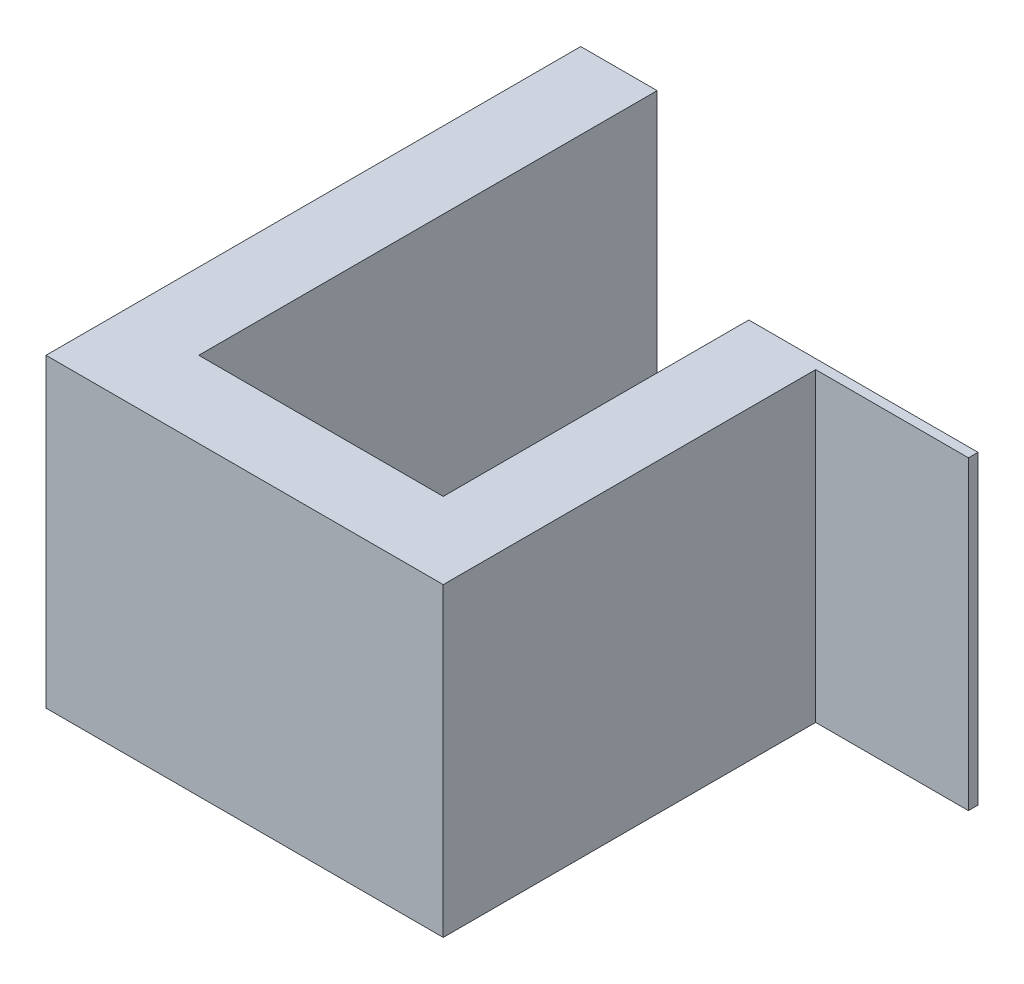
ISO-10303-21;
HEADER;
FILE_DESCRIPTION(('STEP AP214'),'2;1');
FILE_NAME('part.step','',(''),(''),'','','');
FILE_SCHEMA(('AUTOMOTIVE_DESIGN { 1 0 10303 214 1 1 1 1 }'));
ENDSEC;
DATA;
#1=APPLICATION_CONTEXT('core data for automotive mechanical design processes');
#2=APPLICATION_PROTOCOL_DEFINITION('international standard','automotive_design',2000,#1);
#3=PRODUCT_CONTEXT('',#1,'mechanical');
#4=PRODUCT('Part','Part','',(#3));
#5=PRODUCT_RELATED_PRODUCT_CATEGORY('part','',(#4));
#6=PRODUCT_DEFINITION_FORMATION('','',#4);
#7=PRODUCT_DEFINITION_CONTEXT('part definition',#1,'design');
#8=PRODUCT_DEFINITION('design','',#6,#7);
#9=PRODUCT_DEFINITION_SHAPE('','',#8);
#10=(LENGTH_UNIT() NAMED_UNIT(*) SI_UNIT(.MILLI.,.METRE.));
#11=(NAMED_UNIT(*) PLANE_ANGLE_UNIT() SI_UNIT($,.RADIAN.));
#12=(NAMED_UNIT(*) SI_UNIT($,.STERADIAN.) SOLID_ANGLE_UNIT());
#13=UNCERTAINTY_MEASURE_WITH_UNIT(LENGTH_MEASURE(1.E-05),#10,'distance_accuracy_value','');
#14=(GEOMETRIC_REPRESENTATION_CONTEXT(3) GLOBAL_UNCERTAINTY_ASSIGNED_CONTEXT((#13)) GLOBAL_UNIT_ASSIGNED_CONTEXT((#10,
#11,#12)) REPRESENTATION_CONTEXT('',''));
#15=CARTESIAN_POINT('',(0.,0.,0.));
#16=DIRECTION('',(0.,0.,1.));
#17=DIRECTION('',(1.,0.,0.));
#18=AXIS2_PLACEMENT_3D('',#15,#16,#17);
#19=CARTESIAN_POINT('',(0.,12.7,15.875));
#20=DIRECTION('',(0.,0.,-1.));
#21=DIRECTION('',(-1.,0.,0.));
#22=AXIS2_PLACEMENT_3D('',#19,#20,#21);
#23=PLANE('',#22);
#24=DIRECTION('',(1.,0.,0.));
#25=VECTOR('',#24,1.);
#26=CARTESIAN_POINT('',(0.,0.,15.875));
#27=LINE('',#26,#25);
#28=CARTESIAN_POINT('',(-13.335,0.,15.875));
#29=VERTEX_POINT('',#28);
#30=CARTESIAN_POINT('',(3.175,0.,15.875));
#31=VERTEX_POINT('',#30);
#32=EDGE_CURVE('E153',#29,#31,#27,.T.);
#33=ORIENTED_EDGE('',*,*,#32,.T.);
#34=DIRECTION('',(0.,-1.,0.));
#35=VECTOR('',#34,1.);
#36=CARTESIAN_POINT('',(3.175,12.7,15.875));
#37=LINE('',#36,#35);
#38=CARTESIAN_POINT('',(3.175,12.7,15.875));
#39=VERTEX_POINT('',#38);
#40=EDGE_CURVE('E87',#39,#31,#37,.T.);
#41=ORIENTED_EDGE('',*,*,#40,.F.);
#42=DIRECTION('',(1.,0.,0.));
#43=VECTOR('',#42,1.);
#44=CARTESIAN_POINT('',(0.,12.7,15.875));
#45=LINE('',#44,#43);
#46=CARTESIAN_POINT('',(-13.335,12.7,15.875));
#47=VERTEX_POINT('',#46);
#48=EDGE_CURVE('E185',#47,#39,#45,.T.);
#49=ORIENTED_EDGE('',*,*,#48,.F.);
#50=DIRECTION('',(0.,-1.,0.));
#51=VECTOR('',#50,1.);
#52=CARTESIAN_POINT('',(-13.335,12.7,15.875));
#53=LINE('',#52,#51);
#54=EDGE_CURVE('E186',#47,#29,#53,.T.);
#55=ORIENTED_EDGE('',*,*,#54,.T.);
#56=EDGE_LOOP('',(#33,#41,#49,#55));
#57=FACE_BOUND('',#56,.T.);
#58=ADVANCED_FACE('F77',(#57),#23,.F.);
#59=CARTESIAN_POINT('',(3.175,12.7,0.));
#60=DIRECTION('',(1.,0.,0.));
#61=DIRECTION('',(0.,0.,-1.));
#62=AXIS2_PLACEMENT_3D('',#59,#60,#61);
#63=PLANE('',#62);
#64=DIRECTION('',(0.,-1.,0.));
#65=VECTOR('',#64,1.);
#66=CARTESIAN_POINT('',(3.175,12.7,0.396875));
#67=LINE('',#66,#65);
#68=CARTESIAN_POINT('',(3.175,12.7,0.396875));
#69=VERTEX_POINT('',#68);
#70=CARTESIAN_POINT('',(3.175,0.,0.396875));
#71=VERTEX_POINT('',#70);
#72=EDGE_CURVE('E12',#69,#71,#67,.T.);
#73=ORIENTED_EDGE('',*,*,#72,.F.);
#74=DIRECTION('',(0.,0.,1.));
#75=VECTOR('',#74,1.);
#76=CARTESIAN_POINT('',(3.175,12.7,0.));
#77=LINE('',#76,#75);
#78=EDGE_CURVE('E218',#69,#39,#77,.T.);
#79=ORIENTED_EDGE('',*,*,#78,.T.);
#80=ORIENTED_EDGE('',*,*,#40,.T.);
#81=DIRECTION('',(0.,0.,1.));
#82=VECTOR('',#81,1.);
#83=CARTESIAN_POINT('',(3.175,0.,0.));
#84=LINE('',#83,#82);
#85=EDGE_CURVE('E131',#71,#31,#84,.T.);
#86=ORIENTED_EDGE('',*,*,#85,.F.);
#87=EDGE_LOOP('',(#73,#79,#80,#86));
#88=FACE_BOUND('',#87,.T.);
#89=ADVANCED_FACE('F220',(#88),#63,.T.);
#90=CARTESIAN_POINT('',(0.,12.7,0.));
#91=DIRECTION('',(0.,0.,-1.));
#92=DIRECTION('',(-1.,0.,0.));
#93=AXIS2_PLACEMENT_3D('',#90,#91,#92);
#94=PLANE('',#93);
#95=DIRECTION('',(1.,0.,0.));
#96=VECTOR('',#95,1.);
#97=CARTESIAN_POINT('',(0.,0.,0.));
#98=LINE('',#97,#96);
#99=CARTESIAN_POINT('',(0.,0.,0.));
#100=VERTEX_POINT('',#99);
#101=CARTESIAN_POINT('',(9.525,0.,0.));
#102=VERTEX_POINT('',#101);
#103=EDGE_CURVE('E118',#100,#102,#98,.T.);
#104=ORIENTED_EDGE('',*,*,#103,.F.);
#105=DIRECTION('',(0.,-1.,0.));
#106=VECTOR('',#105,1.);
#107=CARTESIAN_POINT('',(0.,12.7,0.));
#108=LINE('',#107,#106);
#109=CARTESIAN_POINT('',(0.,12.7,0.));
#110=VERTEX_POINT('',#109);
#111=EDGE_CURVE('E205',#110,#100,#108,.T.);
#112=ORIENTED_EDGE('',*,*,#111,.F.);
#113=DIRECTION('',(1.,0.,0.));
#114=VECTOR('',#113,1.);
#115=CARTESIAN_POINT('',(0.,12.7,0.));
#116=LINE('',#115,#114);
#117=CARTESIAN_POINT('',(9.525,12.7,0.));
#118=VERTEX_POINT('',#117);
#119=EDGE_CURVE('E137',#110,#118,#116,.T.);
#120=ORIENTED_EDGE('',*,*,#119,.T.);
#121=DIRECTION('',(0.,-1.,0.));
#122=VECTOR('',#121,1.);
#123=CARTESIAN_POINT('',(9.525,12.7,0.));
#124=LINE('',#123,#122);
#125=EDGE_CURVE('E134',#118,#102,#124,.T.);
#126=ORIENTED_EDGE('',*,*,#125,.T.);
#127=EDGE_LOOP('',(#104,#112,#120,#126));
#128=FACE_BOUND('',#127,.T.);
#129=ADVANCED_FACE('F135',(#128),#94,.T.);
#130=CARTESIAN_POINT('',(0.,12.7,0.));
#131=DIRECTION('',(1.,0.,0.));
#132=DIRECTION('',(0.,0.,-1.));
#133=AXIS2_PLACEMENT_3D('',#130,#131,#132);
#134=PLANE('',#133);
#135=DIRECTION('',(0.,0.,1.));
#136=VECTOR('',#135,1.);
#137=CARTESIAN_POINT('',(0.,0.,0.));
#138=LINE('',#137,#136);
#139=CARTESIAN_POINT('',(0.,0.,12.7));
#140=VERTEX_POINT('',#139);
#141=EDGE_CURVE('E127',#100,#140,#138,.T.);
#142=ORIENTED_EDGE('',*,*,#141,.T.);
#143=DIRECTION('',(0.,-1.,0.));
#144=VECTOR('',#143,1.);
#145=CARTESIAN_POINT('',(0.,12.7,12.7));
#146=LINE('',#145,#144);
#147=CARTESIAN_POINT('',(0.,12.7,12.7));
#148=VERTEX_POINT('',#147);
#149=EDGE_CURVE('E201',#148,#140,#146,.T.);
#150=ORIENTED_EDGE('',*,*,#149,.F.);
#151=DIRECTION('',(0.,0.,1.));
#152=VECTOR('',#151,1.);
#153=CARTESIAN_POINT('',(0.,12.7,0.));
#154=LINE('',#153,#152);
#155=EDGE_CURVE('E274',#110,#148,#154,.T.);
#156=ORIENTED_EDGE('',*,*,#155,.F.);
#157=ORIENTED_EDGE('',*,*,#111,.T.);
#158=EDGE_LOOP('',(#142,#150,#156,#157));
#159=FACE_BOUND('',#158,.T.);
#160=ADVANCED_FACE('F273',(#159),#134,.F.);
#161=CARTESIAN_POINT('',(0.,12.7,12.7));
#162=DIRECTION('',(0.,0.,1.));
#163=DIRECTION('',(1.,0.,0.));
#164=AXIS2_PLACEMENT_3D('',#161,#162,#163);
#165=PLANE('',#164);
#166=DIRECTION('',(-1.,0.,0.));
#167=VECTOR('',#166,1.);
#168=CARTESIAN_POINT('',(0.,0.,12.7));
#169=LINE('',#168,#167);
#170=CARTESIAN_POINT('',(-10.16,0.,12.7));
#171=VERTEX_POINT('',#170);
#172=EDGE_CURVE('E169',#140,#171,#169,.T.);
#173=ORIENTED_EDGE('',*,*,#172,.T.);
#174=DIRECTION('',(0.,-1.,0.));
#175=VECTOR('',#174,1.);
#176=CARTESIAN_POINT('',(-10.16,12.7,12.7));
#177=LINE('',#176,#175);
#178=CARTESIAN_POINT('',(-10.16,12.7,12.7));
#179=VERTEX_POINT('',#178);
#180=EDGE_CURVE('E197',#179,#171,#177,.T.);
#181=ORIENTED_EDGE('',*,*,#180,.F.);
#182=DIRECTION('',(-1.,0.,0.));
#183=VECTOR('',#182,1.);
#184=CARTESIAN_POINT('',(0.,12.7,12.7));
#185=LINE('',#184,#183);
#186=EDGE_CURVE('E269',#148,#179,#185,.T.);
#187=ORIENTED_EDGE('',*,*,#186,.F.);
#188=ORIENTED_EDGE('',*,*,#149,.T.);
#189=EDGE_LOOP('',(#173,#181,#187,#188));
#190=FACE_BOUND('',#189,.T.);
#191=ADVANCED_FACE('F268',(#190),#165,.F.);
#192=CARTESIAN_POINT('',(-10.16,12.7,0.));
#193=DIRECTION('',(-1.,0.,0.));
#194=DIRECTION('',(0.,0.,1.));
#195=AXIS2_PLACEMENT_3D('',#192,#193,#194);
#196=PLANE('',#195);
#197=DIRECTION('',(0.,0.,-1.));
#198=VECTOR('',#197,1.);
#199=CARTESIAN_POINT('',(-10.16,0.,0.));
#200=LINE('',#199,#198);
#201=CARTESIAN_POINT('',(-10.16,0.,-6.35));
#202=VERTEX_POINT('',#201);
#203=EDGE_CURVE('E173',#171,#202,#200,.T.);
#204=ORIENTED_EDGE('',*,*,#203,.T.);
#205=DIRECTION('',(0.,-1.,0.));
#206=VECTOR('',#205,1.);
#207=CARTESIAN_POINT('',(-10.16,12.7,-6.35));
#208=LINE('',#207,#206);
#209=CARTESIAN_POINT('',(-10.16,12.7,-6.35));
#210=VERTEX_POINT('',#209);
#211=EDGE_CURVE('E193',#210,#202,#208,.T.);
#212=ORIENTED_EDGE('',*,*,#211,.F.);
#213=DIRECTION('',(0.,0.,-1.));
#214=VECTOR('',#213,1.);
#215=CARTESIAN_POINT('',(-10.16,12.7,0.));
#216=LINE('',#215,#214);
#217=EDGE_CURVE('E265',#179,#210,#216,.T.);
#218=ORIENTED_EDGE('',*,*,#217,.F.);
#219=ORIENTED_EDGE('',*,*,#180,.T.);
#220=EDGE_LOOP('',(#204,#212,#218,#219));
#221=FACE_BOUND('',#220,.T.);
#222=ADVANCED_FACE('F262',(#221),#196,.F.);
#223=CARTESIAN_POINT('',(0.,12.7,-6.34999999999999));
#224=DIRECTION('',(0.,0.,1.));
#225=DIRECTION('',(1.,0.,0.));
#226=AXIS2_PLACEMENT_3D('',#223,#224,#225);
#227=PLANE('',#226);
#228=DIRECTION('',(-1.,0.,0.));
#229=VECTOR('',#228,1.);
#230=CARTESIAN_POINT('',(0.,0.,-6.34999999999999));
#231=LINE('',#230,#229);
#232=CARTESIAN_POINT('',(-13.335,0.,-6.35));
#233=VERTEX_POINT('',#232);
#234=EDGE_CURVE('E177',#202,#233,#231,.T.);
#235=ORIENTED_EDGE('',*,*,#234,.T.);
#236=DIRECTION('',(0.,-1.,0.));
#237=VECTOR('',#236,1.);
#238=CARTESIAN_POINT('',(-13.335,12.7,-6.35));
#239=LINE('',#238,#237);
#240=CARTESIAN_POINT('',(-13.335,12.7,-6.35));
#241=VERTEX_POINT('',#240);
#242=EDGE_CURVE('E189',#241,#233,#239,.T.);
#243=ORIENTED_EDGE('',*,*,#242,.F.);
#244=DIRECTION('',(-1.,0.,0.));
#245=VECTOR('',#244,1.);
#246=CARTESIAN_POINT('',(0.,12.7,-6.34999999999999));
#247=LINE('',#246,#245);
#248=EDGE_CURVE('E284',#210,#241,#247,.T.);
#249=ORIENTED_EDGE('',*,*,#248,.F.);
#250=ORIENTED_EDGE('',*,*,#211,.T.);
#251=EDGE_LOOP('',(#235,#243,#249,#250));
#252=FACE_BOUND('',#251,.T.);
#253=ADVANCED_FACE('F258',(#252),#227,.F.);
#254=CARTESIAN_POINT('',(-13.335,12.7,0.));
#255=DIRECTION('',(-1.,0.,0.));
#256=DIRECTION('',(0.,0.,1.));
#257=AXIS2_PLACEMENT_3D('',#254,#255,#256);
#258=PLANE('',#257);
#259=DIRECTION('',(0.,0.,-1.));
#260=VECTOR('',#259,1.);
#261=CARTESIAN_POINT('',(-13.335,0.,0.));
#262=LINE('',#261,#260);
#263=EDGE_CURVE('E181',#29,#233,#262,.T.);
#264=ORIENTED_EDGE('',*,*,#263,.F.);
#265=ORIENTED_EDGE('',*,*,#54,.F.);
#266=DIRECTION('',(0.,0.,-1.));
#267=VECTOR('',#266,1.);
#268=CARTESIAN_POINT('',(-13.335,12.7,0.));
#269=LINE('',#268,#267);
#270=EDGE_CURVE('E164',#47,#241,#269,.T.);
#271=ORIENTED_EDGE('',*,*,#270,.T.);
#272=ORIENTED_EDGE('',*,*,#242,.T.);
#273=EDGE_LOOP('',(#264,#265,#271,#272));
#274=FACE_BOUND('',#273,.T.);
#275=ADVANCED_FACE('F254',(#274),#258,.T.);
#276=CARTESIAN_POINT('',(0.,12.7,0.));
#277=DIRECTION('',(0.,1.,0.));
#278=DIRECTION('',(0.,0.,1.));
#279=AXIS2_PLACEMENT_3D('',#276,#277,#278);
#280=PLANE('',#279);
#281=ORIENTED_EDGE('',*,*,#48,.T.);
#282=ORIENTED_EDGE('',*,*,#78,.F.);
#283=DIRECTION('',(1.,0.,0.));
#284=VECTOR('',#283,1.);
#285=CARTESIAN_POINT('',(3.175,12.7,0.396875));
#286=LINE('',#285,#284);
#287=CARTESIAN_POINT('',(9.525,12.7,0.396875));
#288=VERTEX_POINT('',#287);
#289=EDGE_CURVE('E144',#69,#288,#286,.T.);
#290=ORIENTED_EDGE('',*,*,#289,.T.);
#291=DIRECTION('',(0.,0.,1.));
#292=VECTOR('',#291,1.);
#293=CARTESIAN_POINT('',(9.525,12.7,0.));
#294=LINE('',#293,#292);
#295=EDGE_CURVE('E140',#118,#288,#294,.T.);
#296=ORIENTED_EDGE('',*,*,#295,.F.);
#297=ORIENTED_EDGE('',*,*,#119,.F.);
#298=ORIENTED_EDGE('',*,*,#155,.T.);
#299=ORIENTED_EDGE('',*,*,#186,.T.);
#300=ORIENTED_EDGE('',*,*,#217,.T.);
#301=ORIENTED_EDGE('',*,*,#248,.T.);
#302=ORIENTED_EDGE('',*,*,#270,.F.);
#303=EDGE_LOOP('',(#281,#282,#290,#296,#297,#298,#299,#300,#301,#302));
#304=FACE_BOUND('',#303,.T.);
#305=ADVANCED_FACE('F214',(#304),#280,.T.);
#306=CARTESIAN_POINT('',(0.,0.,0.));
#307=DIRECTION('',(0.,1.,0.));
#308=DIRECTION('',(0.,0.,1.));
#309=AXIS2_PLACEMENT_3D('',#306,#307,#308);
#310=PLANE('',#309);
#311=ORIENTED_EDGE('',*,*,#32,.F.);
#312=ORIENTED_EDGE('',*,*,#263,.T.);
#313=ORIENTED_EDGE('',*,*,#234,.F.);
#314=ORIENTED_EDGE('',*,*,#203,.F.);
#315=ORIENTED_EDGE('',*,*,#172,.F.);
#316=ORIENTED_EDGE('',*,*,#141,.F.);
#317=ORIENTED_EDGE('',*,*,#103,.T.);
#318=DIRECTION('',(0.,0.,1.));
#319=VECTOR('',#318,1.);
#320=CARTESIAN_POINT('',(9.525,0.,0.));
#321=LINE('',#320,#319);
#322=CARTESIAN_POINT('',(9.525,0.,0.396875));
#323=VERTEX_POINT('',#322);
#324=EDGE_CURVE('E123',#102,#323,#321,.T.);
#325=ORIENTED_EDGE('',*,*,#324,.T.);
#326=DIRECTION('',(1.,0.,0.));
#327=VECTOR('',#326,1.);
#328=CARTESIAN_POINT('',(3.175,0.,0.396875));
#329=LINE('',#328,#327);
#330=EDGE_CURVE('E145',#71,#323,#329,.T.);
#331=ORIENTED_EDGE('',*,*,#330,.F.);
#332=ORIENTED_EDGE('',*,*,#85,.T.);
#333=EDGE_LOOP('',(#311,#312,#313,#314,#315,#316,#317,#325,#331,#332));
#334=FACE_BOUND('',#333,.T.);
#335=ADVANCED_FACE('F121',(#334),#310,.F.);
#336=CARTESIAN_POINT('',(9.525,12.7,0.));
#337=DIRECTION('',(1.,0.,0.));
#338=DIRECTION('',(0.,0.,-1.));
#339=AXIS2_PLACEMENT_3D('',#336,#337,#338);
#340=PLANE('',#339);
#341=ORIENTED_EDGE('',*,*,#324,.F.);
#342=ORIENTED_EDGE('',*,*,#125,.F.);
#343=ORIENTED_EDGE('',*,*,#295,.T.);
#344=DIRECTION('',(0.,-1.,0.));
#345=VECTOR('',#344,1.);
#346=CARTESIAN_POINT('',(9.525,12.7,0.396875));
#347=LINE('',#346,#345);
#348=EDGE_CURVE('E111',#288,#323,#347,.T.);
#349=ORIENTED_EDGE('',*,*,#348,.T.);
#350=EDGE_LOOP('',(#341,#342,#343,#349));
#351=FACE_BOUND('',#350,.T.);
#352=ADVANCED_FACE('F142',(#351),#340,.T.);
#353=CARTESIAN_POINT('',(3.175,12.7,0.396875));
#354=DIRECTION('',(0.,0.,-1.));
#355=DIRECTION('',(-1.,0.,0.));
#356=AXIS2_PLACEMENT_3D('',#353,#354,#355);
#357=PLANE('',#356);
#358=ORIENTED_EDGE('',*,*,#330,.T.);
#359=ORIENTED_EDGE('',*,*,#348,.F.);
#360=ORIENTED_EDGE('',*,*,#289,.F.);
#361=ORIENTED_EDGE('',*,*,#72,.T.);
#362=EDGE_LOOP('',(#358,#359,#360,#361));
#363=FACE_BOUND('',#362,.T.);
#364=ADVANCED_FACE('F79',(#363),#357,.F.);
#365=CLOSED_SHELL('',(#58,#89,#129,#160,#191,#222,#253,#275,#305,#335,#352,#364));
#366=MANIFOLD_SOLID_BREP('B2',#365);
#367=ADVANCED_BREP_SHAPE_REPRESENTATION('',(#18,#366),#14);
#368=SHAPE_DEFINITION_REPRESENTATION(#9,#367);
ENDSEC;
END-ISO-10303-21;
